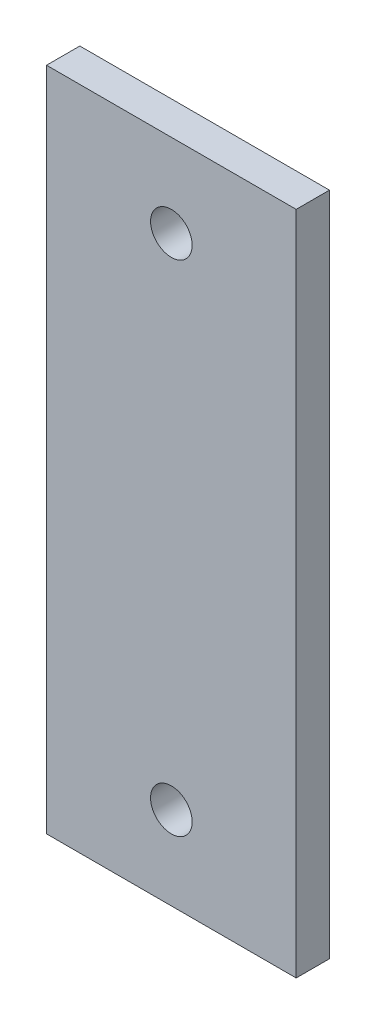
ISO-10303-21;
HEADER;
FILE_DESCRIPTION(('STEP AP214'),'2;1');
FILE_NAME('part.step','',(''),(''),'','','');
FILE_SCHEMA(('AUTOMOTIVE_DESIGN { 1 0 10303 214 1 1 1 1 }'));
ENDSEC;
DATA;
#1=APPLICATION_CONTEXT('core data for automotive mechanical design processes');
#2=APPLICATION_PROTOCOL_DEFINITION('international standard','automotive_design',2000,#1);
#3=PRODUCT_CONTEXT('',#1,'mechanical');
#4=PRODUCT('Part','Part','',(#3));
#5=PRODUCT_RELATED_PRODUCT_CATEGORY('part','',(#4));
#6=PRODUCT_DEFINITION_FORMATION('','',#4);
#7=PRODUCT_DEFINITION_CONTEXT('part definition',#1,'design');
#8=PRODUCT_DEFINITION('design','',#6,#7);
#9=PRODUCT_DEFINITION_SHAPE('','',#8);
#10=(LENGTH_UNIT() NAMED_UNIT(*) SI_UNIT(.MILLI.,.METRE.));
#11=(NAMED_UNIT(*) PLANE_ANGLE_UNIT() SI_UNIT($,.RADIAN.));
#12=(NAMED_UNIT(*) SI_UNIT($,.STERADIAN.) SOLID_ANGLE_UNIT());
#13=UNCERTAINTY_MEASURE_WITH_UNIT(LENGTH_MEASURE(1.E-05),#10,'distance_accuracy_value','');
#14=(GEOMETRIC_REPRESENTATION_CONTEXT(3) GLOBAL_UNCERTAINTY_ASSIGNED_CONTEXT((#13)) GLOBAL_UNIT_ASSIGNED_CONTEXT((#10,
#11,#12)) REPRESENTATION_CONTEXT('',''));
#15=CARTESIAN_POINT('',(0.,0.,0.));
#16=DIRECTION('',(0.,0.,1.));
#17=DIRECTION('',(1.,0.,0.));
#18=AXIS2_PLACEMENT_3D('',#15,#16,#17);
#19=CARTESIAN_POINT('',(0.,0.,4.));
#20=DIRECTION('',(0.,0.,1.));
#21=DIRECTION('',(1.,0.,0.));
#22=AXIS2_PLACEMENT_3D('',#19,#20,#21);
#23=PLANE('',#22);
#24=CARTESIAN_POINT('',(0.,30.,4.));
#25=DIRECTION('',(0.,0.,1.));
#26=DIRECTION('',(1.,0.,0.));
#27=AXIS2_PLACEMENT_3D('',#24,#25,#26);
#28=CIRCLE('',#27,2.5);
#29=CARTESIAN_POINT('',(2.5,30.,4.));
#30=VERTEX_POINT('',#29);
#31=EDGE_CURVE('E118',#30,#30,#28,.T.);
#32=ORIENTED_EDGE('',*,*,#31,.F.);
#33=EDGE_LOOP('',(#32));
#34=FACE_BOUND('',#33,.T.);
#35=DIRECTION('',(0.,1.,0.));
#36=VECTOR('',#35,1.);
#37=CARTESIAN_POINT('',(15.,40.,4.));
#38=LINE('',#37,#36);
#39=CARTESIAN_POINT('',(15.,-40.,4.));
#40=VERTEX_POINT('',#39);
#41=CARTESIAN_POINT('',(15.,40.,4.));
#42=VERTEX_POINT('',#41);
#43=EDGE_CURVE('E98',#40,#42,#38,.T.);
#44=ORIENTED_EDGE('',*,*,#43,.T.);
#45=DIRECTION('',(-1.,0.,0.));
#46=VECTOR('',#45,1.);
#47=CARTESIAN_POINT('',(-15.,40.,4.));
#48=LINE('',#47,#46);
#49=CARTESIAN_POINT('',(-15.,40.,4.));
#50=VERTEX_POINT('',#49);
#51=EDGE_CURVE('E93',#42,#50,#48,.T.);
#52=ORIENTED_EDGE('',*,*,#51,.T.);
#53=DIRECTION('',(0.,-1.,0.));
#54=VECTOR('',#53,1.);
#55=CARTESIAN_POINT('',(-15.,40.,4.));
#56=LINE('',#55,#54);
#57=CARTESIAN_POINT('',(-15.,-40.,4.));
#58=VERTEX_POINT('',#57);
#59=EDGE_CURVE('E96',#50,#58,#56,.T.);
#60=ORIENTED_EDGE('',*,*,#59,.T.);
#61=DIRECTION('',(1.,0.,0.));
#62=VECTOR('',#61,1.);
#63=CARTESIAN_POINT('',(-15.,-40.,4.));
#64=LINE('',#63,#62);
#65=EDGE_CURVE('E63',#58,#40,#64,.T.);
#66=ORIENTED_EDGE('',*,*,#65,.T.);
#67=EDGE_LOOP('',(#44,#52,#60,#66));
#68=FACE_BOUND('',#67,.T.);
#69=CARTESIAN_POINT('',(0.,-30.,4.));
#70=DIRECTION('',(0.,0.,1.));
#71=DIRECTION('',(-1.,0.,0.));
#72=AXIS2_PLACEMENT_3D('',#69,#70,#71);
#73=CIRCLE('',#72,2.5);
#74=CARTESIAN_POINT('',(-2.50000000000003,-30.,4.));
#75=VERTEX_POINT('',#74);
#76=EDGE_CURVE('E140',#75,#75,#73,.T.);
#77=ORIENTED_EDGE('',*,*,#76,.F.);
#78=EDGE_LOOP('',(#77));
#79=FACE_BOUND('',#78,.T.);
#80=ADVANCED_FACE('F45',(#34,#68,#79),#23,.T.);
#81=CARTESIAN_POINT('',(0.,0.,0.));
#82=DIRECTION('',(0.,0.,1.));
#83=DIRECTION('',(1.,0.,0.));
#84=AXIS2_PLACEMENT_3D('',#81,#82,#83);
#85=PLANE('',#84);
#86=DIRECTION('',(0.,1.,0.));
#87=VECTOR('',#86,1.);
#88=CARTESIAN_POINT('',(15.,40.,0.));
#89=LINE('',#88,#87);
#90=CARTESIAN_POINT('',(15.,-40.,0.));
#91=VERTEX_POINT('',#90);
#92=CARTESIAN_POINT('',(15.,40.,0.));
#93=VERTEX_POINT('',#92);
#94=EDGE_CURVE('E114',#91,#93,#89,.T.);
#95=ORIENTED_EDGE('',*,*,#94,.F.);
#96=DIRECTION('',(1.,0.,0.));
#97=VECTOR('',#96,1.);
#98=CARTESIAN_POINT('',(-15.,-40.,0.));
#99=LINE('',#98,#97);
#100=CARTESIAN_POINT('',(-15.,-40.,0.));
#101=VERTEX_POINT('',#100);
#102=EDGE_CURVE('E86',#101,#91,#99,.T.);
#103=ORIENTED_EDGE('',*,*,#102,.F.);
#104=DIRECTION('',(0.,-1.,0.));
#105=VECTOR('',#104,1.);
#106=CARTESIAN_POINT('',(-15.,40.,0.));
#107=LINE('',#106,#105);
#108=CARTESIAN_POINT('',(-15.,40.,0.));
#109=VERTEX_POINT('',#108);
#110=EDGE_CURVE('E80',#109,#101,#107,.T.);
#111=ORIENTED_EDGE('',*,*,#110,.F.);
#112=DIRECTION('',(-1.,0.,0.));
#113=VECTOR('',#112,1.);
#114=CARTESIAN_POINT('',(-15.,40.,0.));
#115=LINE('',#114,#113);
#116=EDGE_CURVE('E103',#93,#109,#115,.T.);
#117=ORIENTED_EDGE('',*,*,#116,.F.);
#118=EDGE_LOOP('',(#95,#103,#111,#117));
#119=FACE_BOUND('',#118,.T.);
#120=CARTESIAN_POINT('',(0.,30.,0.));
#121=DIRECTION('',(0.,0.,1.));
#122=DIRECTION('',(1.,0.,0.));
#123=AXIS2_PLACEMENT_3D('',#120,#121,#122);
#124=CIRCLE('',#123,2.5);
#125=CARTESIAN_POINT('',(2.5,30.,0.));
#126=VERTEX_POINT('',#125);
#127=EDGE_CURVE('E136',#126,#126,#124,.T.);
#128=ORIENTED_EDGE('',*,*,#127,.T.);
#129=EDGE_LOOP('',(#128));
#130=FACE_BOUND('',#129,.T.);
#131=CARTESIAN_POINT('',(0.,-30.,0.));
#132=DIRECTION('',(0.,0.,1.));
#133=DIRECTION('',(-1.,0.,0.));
#134=AXIS2_PLACEMENT_3D('',#131,#132,#133);
#135=CIRCLE('',#134,2.5);
#136=CARTESIAN_POINT('',(-2.50000000000003,-30.,0.));
#137=VERTEX_POINT('',#136);
#138=EDGE_CURVE('E144',#137,#137,#135,.T.);
#139=ORIENTED_EDGE('',*,*,#138,.T.);
#140=EDGE_LOOP('',(#139));
#141=FACE_BOUND('',#140,.T.);
#142=ADVANCED_FACE('F131',(#119,#130,#141),#85,.F.);
#143=CARTESIAN_POINT('',(15.,40.,4.));
#144=DIRECTION('',(-1.,0.,0.));
#145=DIRECTION('',(0.,-1.,0.));
#146=AXIS2_PLACEMENT_3D('',#143,#144,#145);
#147=PLANE('',#146);
#148=ORIENTED_EDGE('',*,*,#94,.T.);
#149=DIRECTION('',(0.,0.,-1.));
#150=VECTOR('',#149,1.);
#151=CARTESIAN_POINT('',(15.,40.,4.));
#152=LINE('',#151,#150);
#153=EDGE_CURVE('E11',#42,#93,#152,.T.);
#154=ORIENTED_EDGE('',*,*,#153,.F.);
#155=ORIENTED_EDGE('',*,*,#43,.F.);
#156=DIRECTION('',(0.,0.,-1.));
#157=VECTOR('',#156,1.);
#158=CARTESIAN_POINT('',(15.,-40.,4.));
#159=LINE('',#158,#157);
#160=EDGE_CURVE('E110',#40,#91,#159,.T.);
#161=ORIENTED_EDGE('',*,*,#160,.T.);
#162=EDGE_LOOP('',(#148,#154,#155,#161));
#163=FACE_BOUND('',#162,.T.);
#164=ADVANCED_FACE('F47',(#163),#147,.F.);
#165=CARTESIAN_POINT('',(-15.,40.,4.));
#166=DIRECTION('',(0.,-1.,0.));
#167=DIRECTION('',(0.,0.,-1.));
#168=AXIS2_PLACEMENT_3D('',#165,#166,#167);
#169=PLANE('',#168);
#170=ORIENTED_EDGE('',*,*,#116,.T.);
#171=DIRECTION('',(0.,0.,-1.));
#172=VECTOR('',#171,1.);
#173=CARTESIAN_POINT('',(-15.,40.,4.));
#174=LINE('',#173,#172);
#175=EDGE_CURVE('E55',#50,#109,#174,.T.);
#176=ORIENTED_EDGE('',*,*,#175,.F.);
#177=ORIENTED_EDGE('',*,*,#51,.F.);
#178=ORIENTED_EDGE('',*,*,#153,.T.);
#179=EDGE_LOOP('',(#170,#176,#177,#178));
#180=FACE_BOUND('',#179,.T.);
#181=ADVANCED_FACE('F102',(#180),#169,.F.);
#182=CARTESIAN_POINT('',(-15.,40.,4.));
#183=DIRECTION('',(1.,0.,0.));
#184=DIRECTION('',(0.,1.,0.));
#185=AXIS2_PLACEMENT_3D('',#182,#183,#184);
#186=PLANE('',#185);
#187=ORIENTED_EDGE('',*,*,#110,.T.);
#188=DIRECTION('',(0.,0.,-1.));
#189=VECTOR('',#188,1.);
#190=CARTESIAN_POINT('',(-15.,-40.,4.));
#191=LINE('',#190,#189);
#192=EDGE_CURVE('E105',#58,#101,#191,.T.);
#193=ORIENTED_EDGE('',*,*,#192,.F.);
#194=ORIENTED_EDGE('',*,*,#59,.F.);
#195=ORIENTED_EDGE('',*,*,#175,.T.);
#196=EDGE_LOOP('',(#187,#193,#194,#195));
#197=FACE_BOUND('',#196,.T.);
#198=ADVANCED_FACE('F106',(#197),#186,.F.);
#199=CARTESIAN_POINT('',(-15.,-40.,4.));
#200=DIRECTION('',(0.,1.,0.));
#201=DIRECTION('',(0.,0.,1.));
#202=AXIS2_PLACEMENT_3D('',#199,#200,#201);
#203=PLANE('',#202);
#204=ORIENTED_EDGE('',*,*,#102,.T.);
#205=ORIENTED_EDGE('',*,*,#160,.F.);
#206=ORIENTED_EDGE('',*,*,#65,.F.);
#207=ORIENTED_EDGE('',*,*,#192,.T.);
#208=EDGE_LOOP('',(#204,#205,#206,#207));
#209=FACE_BOUND('',#208,.T.);
#210=ADVANCED_FACE('F128',(#209),#203,.F.);
#211=CARTESIAN_POINT('',(0.,30.,4.));
#212=DIRECTION('',(0.,0.,-1.));
#213=DIRECTION('',(-1.,0.,0.));
#214=AXIS2_PLACEMENT_3D('',#211,#212,#213);
#215=CYLINDRICAL_SURFACE('',#214,2.5);
#216=ORIENTED_EDGE('',*,*,#31,.T.);
#217=EDGE_LOOP('',(#216));
#218=FACE_BOUND('',#217,.T.);
#219=ORIENTED_EDGE('',*,*,#127,.F.);
#220=EDGE_LOOP('',(#219));
#221=FACE_BOUND('',#220,.T.);
#222=ADVANCED_FACE('F163',(#218,#221),#215,.F.);
#223=CARTESIAN_POINT('',(0.,-30.,4.));
#224=DIRECTION('',(0.,0.,-1.));
#225=DIRECTION('',(-1.,0.,0.));
#226=AXIS2_PLACEMENT_3D('',#223,#224,#225);
#227=CYLINDRICAL_SURFACE('',#226,2.5);
#228=ORIENTED_EDGE('',*,*,#76,.T.);
#229=EDGE_LOOP('',(#228));
#230=FACE_BOUND('',#229,.T.);
#231=ORIENTED_EDGE('',*,*,#138,.F.);
#232=EDGE_LOOP('',(#231));
#233=FACE_BOUND('',#232,.T.);
#234=ADVANCED_FACE('F152',(#230,#233),#227,.F.);
#235=CLOSED_SHELL('',(#80,#142,#164,#181,#198,#210,#222,#234));
#236=MANIFOLD_SOLID_BREP('B2',#235);
#237=ADVANCED_BREP_SHAPE_REPRESENTATION('',(#18,#236),#14);
#238=SHAPE_DEFINITION_REPRESENTATION(#9,#237);
ENDSEC;
END-ISO-10303-21;
